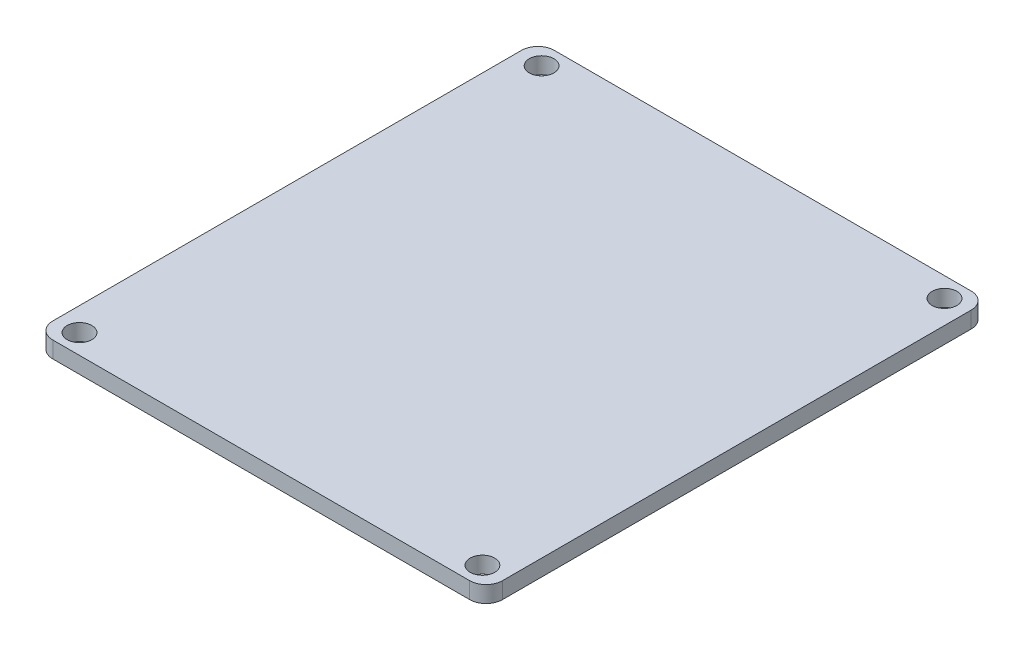
ISO-10303-21;
HEADER;
FILE_DESCRIPTION(('STEP AP214'),'2;1');
FILE_NAME('part.step','',(''),(''),'','','');
FILE_SCHEMA(('AUTOMOTIVE_DESIGN { 1 0 10303 214 1 1 1 1 }'));
ENDSEC;
DATA;
#1=APPLICATION_CONTEXT('core data for automotive mechanical design processes');
#2=APPLICATION_PROTOCOL_DEFINITION('international standard','automotive_design',2000,#1);
#3=PRODUCT_CONTEXT('',#1,'mechanical');
#4=PRODUCT('Part','Part','',(#3));
#5=PRODUCT_RELATED_PRODUCT_CATEGORY('part','',(#4));
#6=PRODUCT_DEFINITION_FORMATION('','',#4);
#7=PRODUCT_DEFINITION_CONTEXT('part definition',#1,'design');
#8=PRODUCT_DEFINITION('design','',#6,#7);
#9=PRODUCT_DEFINITION_SHAPE('','',#8);
#10=(LENGTH_UNIT() NAMED_UNIT(*) SI_UNIT(.MILLI.,.METRE.));
#11=(NAMED_UNIT(*) PLANE_ANGLE_UNIT() SI_UNIT($,.RADIAN.));
#12=(NAMED_UNIT(*) SI_UNIT($,.STERADIAN.) SOLID_ANGLE_UNIT());
#13=UNCERTAINTY_MEASURE_WITH_UNIT(LENGTH_MEASURE(1.E-05),#10,'distance_accuracy_value','');
#14=(GEOMETRIC_REPRESENTATION_CONTEXT(3) GLOBAL_UNCERTAINTY_ASSIGNED_CONTEXT((#13)) GLOBAL_UNIT_ASSIGNED_CONTEXT((#10,
#11,#12)) REPRESENTATION_CONTEXT('',''));
#15=CARTESIAN_POINT('',(0.,0.,0.));
#16=DIRECTION('',(0.,0.,1.));
#17=DIRECTION('',(1.,0.,0.));
#18=AXIS2_PLACEMENT_3D('',#15,#16,#17);
#19=CARTESIAN_POINT('',(0.,2.,0.));
#20=DIRECTION('',(0.,1.,0.));
#21=DIRECTION('',(0.,0.,1.));
#22=AXIS2_PLACEMENT_3D('',#19,#20,#21);
#23=PLANE('',#22);
#24=CARTESIAN_POINT('',(24.5,2.,-28.1));
#25=DIRECTION('',(0.,1.,0.));
#26=DIRECTION('',(0.,0.,-1.));
#27=AXIS2_PLACEMENT_3D('',#24,#25,#26);
#28=CIRCLE('',#27,1.5);
#29=CARTESIAN_POINT('',(24.5,2.,-29.6));
#30=VERTEX_POINT('',#29);
#31=EDGE_CURVE('E183',#30,#30,#28,.T.);
#32=ORIENTED_EDGE('',*,*,#31,.F.);
#33=EDGE_LOOP('',(#32));
#34=FACE_BOUND('',#33,.T.);
#35=CARTESIAN_POINT('',(-24.5,2.,-28.1));
#36=DIRECTION('',(0.,1.,0.));
#37=DIRECTION('',(0.,0.,1.));
#38=AXIS2_PLACEMENT_3D('',#35,#36,#37);
#39=CIRCLE('',#38,1.5);
#40=CARTESIAN_POINT('',(-24.5,2.,-26.6));
#41=VERTEX_POINT('',#40);
#42=EDGE_CURVE('E166',#41,#41,#39,.T.);
#43=ORIENTED_EDGE('',*,*,#42,.F.);
#44=EDGE_LOOP('',(#43));
#45=FACE_BOUND('',#44,.T.);
#46=DIRECTION('',(0.,0.,1.));
#47=VECTOR('',#46,1.);
#48=CARTESIAN_POINT('',(-27.35,2.,-30.5));
#49=LINE('',#48,#47);
#50=CARTESIAN_POINT('',(-27.35,2.,-28.5));
#51=VERTEX_POINT('',#50);
#52=CARTESIAN_POINT('',(-27.35,2.,28.5));
#53=VERTEX_POINT('',#52);
#54=EDGE_CURVE('E173',#51,#53,#49,.T.);
#55=ORIENTED_EDGE('',*,*,#54,.T.);
#56=CARTESIAN_POINT('',(-25.35,2.,28.5));
#57=DIRECTION('',(0.,1.,0.));
#58=DIRECTION('',(0.,0.,1.));
#59=AXIS2_PLACEMENT_3D('',#56,#57,#58);
#60=CIRCLE('',#59,2.);
#61=CARTESIAN_POINT('',(-25.35,2.,30.5));
#62=VERTEX_POINT('',#61);
#63=EDGE_CURVE('E150',#53,#62,#60,.T.);
#64=ORIENTED_EDGE('',*,*,#63,.T.);
#65=DIRECTION('',(1.,0.,0.));
#66=VECTOR('',#65,1.);
#67=CARTESIAN_POINT('',(-27.35,2.,30.5));
#68=LINE('',#67,#66);
#69=CARTESIAN_POINT('',(25.35,2.,30.5));
#70=VERTEX_POINT('',#69);
#71=EDGE_CURVE('E121',#62,#70,#68,.T.);
#72=ORIENTED_EDGE('',*,*,#71,.T.);
#73=CARTESIAN_POINT('',(25.35,2.,28.5));
#74=DIRECTION('',(0.,1.,0.));
#75=DIRECTION('',(0.,0.,1.));
#76=AXIS2_PLACEMENT_3D('',#73,#74,#75);
#77=CIRCLE('',#76,2.);
#78=CARTESIAN_POINT('',(27.35,2.,28.5));
#79=VERTEX_POINT('',#78);
#80=EDGE_CURVE('E145',#70,#79,#77,.T.);
#81=ORIENTED_EDGE('',*,*,#80,.T.);
#82=DIRECTION('',(0.,0.,-1.));
#83=VECTOR('',#82,1.);
#84=CARTESIAN_POINT('',(27.35,2.,-30.5));
#85=LINE('',#84,#83);
#86=CARTESIAN_POINT('',(27.35,2.,-28.5));
#87=VERTEX_POINT('',#86);
#88=EDGE_CURVE('E128',#79,#87,#85,.T.);
#89=ORIENTED_EDGE('',*,*,#88,.T.);
#90=CARTESIAN_POINT('',(25.35,2.,-28.5));
#91=DIRECTION('',(0.,1.,0.));
#92=DIRECTION('',(0.,0.,1.));
#93=AXIS2_PLACEMENT_3D('',#90,#91,#92);
#94=CIRCLE('',#93,2.);
#95=CARTESIAN_POINT('',(25.35,2.,-30.5));
#96=VERTEX_POINT('',#95);
#97=EDGE_CURVE('E57',#87,#96,#94,.T.);
#98=ORIENTED_EDGE('',*,*,#97,.T.);
#99=DIRECTION('',(-1.,0.,0.));
#100=VECTOR('',#99,1.);
#101=CARTESIAN_POINT('',(-27.35,2.,-30.5));
#102=LINE('',#101,#100);
#103=CARTESIAN_POINT('',(-25.35,2.,-30.5));
#104=VERTEX_POINT('',#103);
#105=EDGE_CURVE('E131',#96,#104,#102,.T.);
#106=ORIENTED_EDGE('',*,*,#105,.T.);
#107=CARTESIAN_POINT('',(-25.35,2.,-28.5));
#108=DIRECTION('',(0.,1.,0.));
#109=DIRECTION('',(0.,0.,1.));
#110=AXIS2_PLACEMENT_3D('',#107,#108,#109);
#111=CIRCLE('',#110,2.);
#112=EDGE_CURVE('E148',#104,#51,#111,.T.);
#113=ORIENTED_EDGE('',*,*,#112,.T.);
#114=EDGE_LOOP('',(#55,#64,#72,#81,#89,#98,#106,#113));
#115=FACE_BOUND('',#114,.T.);
#116=CARTESIAN_POINT('',(-24.5,2.,28.1));
#117=DIRECTION('',(0.,1.,0.));
#118=DIRECTION('',(0.,0.,-1.));
#119=AXIS2_PLACEMENT_3D('',#116,#117,#118);
#120=CIRCLE('',#119,1.5);
#121=CARTESIAN_POINT('',(-24.5,2.,26.6));
#122=VERTEX_POINT('',#121);
#123=EDGE_CURVE('E178',#122,#122,#120,.T.);
#124=ORIENTED_EDGE('',*,*,#123,.F.);
#125=EDGE_LOOP('',(#124));
#126=FACE_BOUND('',#125,.T.);
#127=CARTESIAN_POINT('',(24.5,2.,28.1));
#128=DIRECTION('',(0.,1.,0.));
#129=DIRECTION('',(0.,0.,1.));
#130=AXIS2_PLACEMENT_3D('',#127,#128,#129);
#131=CIRCLE('',#130,1.5);
#132=CARTESIAN_POINT('',(24.5,2.,29.6));
#133=VERTEX_POINT('',#132);
#134=EDGE_CURVE('E189',#133,#133,#131,.T.);
#135=ORIENTED_EDGE('',*,*,#134,.F.);
#136=EDGE_LOOP('',(#135));
#137=FACE_BOUND('',#136,.T.);
#138=ADVANCED_FACE('F35',(#34,#45,#115,#126,#137),#23,.T.);
#139=CARTESIAN_POINT('',(0.,0.,0.));
#140=DIRECTION('',(0.,1.,0.));
#141=DIRECTION('',(0.,0.,1.));
#142=AXIS2_PLACEMENT_3D('',#139,#140,#141);
#143=PLANE('',#142);
#144=DIRECTION('',(1.,0.,0.));
#145=VECTOR('',#144,1.);
#146=CARTESIAN_POINT('',(-27.35,0.,30.5));
#147=LINE('',#146,#145);
#148=CARTESIAN_POINT('',(-25.35,0.,30.5));
#149=VERTEX_POINT('',#148);
#150=CARTESIAN_POINT('',(25.35,0.,30.5));
#151=VERTEX_POINT('',#150);
#152=EDGE_CURVE('E118',#149,#151,#147,.T.);
#153=ORIENTED_EDGE('',*,*,#152,.F.);
#154=CARTESIAN_POINT('',(-25.35,0.,28.5));
#155=DIRECTION('',(0.,1.,0.));
#156=DIRECTION('',(0.,0.,1.));
#157=AXIS2_PLACEMENT_3D('',#154,#155,#156);
#158=CIRCLE('',#157,2.);
#159=CARTESIAN_POINT('',(-27.35,0.,28.5));
#160=VERTEX_POINT('',#159);
#161=EDGE_CURVE('E101',#149,#160,#158,.F.);
#162=ORIENTED_EDGE('',*,*,#161,.T.);
#163=DIRECTION('',(0.,0.,1.));
#164=VECTOR('',#163,1.);
#165=CARTESIAN_POINT('',(-27.35,0.,-30.5));
#166=LINE('',#165,#164);
#167=CARTESIAN_POINT('',(-27.35,0.,-28.5));
#168=VERTEX_POINT('',#167);
#169=EDGE_CURVE('E129',#168,#160,#166,.T.);
#170=ORIENTED_EDGE('',*,*,#169,.F.);
#171=CARTESIAN_POINT('',(-25.35,0.,-28.5));
#172=DIRECTION('',(0.,1.,0.));
#173=DIRECTION('',(0.,0.,1.));
#174=AXIS2_PLACEMENT_3D('',#171,#172,#173);
#175=CIRCLE('',#174,2.);
#176=CARTESIAN_POINT('',(-25.35,0.,-30.5));
#177=VERTEX_POINT('',#176);
#178=EDGE_CURVE('E112',#168,#177,#175,.F.);
#179=ORIENTED_EDGE('',*,*,#178,.T.);
#180=DIRECTION('',(-1.,0.,0.));
#181=VECTOR('',#180,1.);
#182=CARTESIAN_POINT('',(-27.35,0.,-30.5));
#183=LINE('',#182,#181);
#184=CARTESIAN_POINT('',(25.35,0.,-30.5));
#185=VERTEX_POINT('',#184);
#186=EDGE_CURVE('E133',#185,#177,#183,.T.);
#187=ORIENTED_EDGE('',*,*,#186,.F.);
#188=CARTESIAN_POINT('',(25.35,0.,-28.5));
#189=DIRECTION('',(0.,1.,0.));
#190=DIRECTION('',(0.,0.,1.));
#191=AXIS2_PLACEMENT_3D('',#188,#189,#190);
#192=CIRCLE('',#191,2.);
#193=CARTESIAN_POINT('',(27.35,0.,-28.5));
#194=VERTEX_POINT('',#193);
#195=EDGE_CURVE('E139',#185,#194,#192,.F.);
#196=ORIENTED_EDGE('',*,*,#195,.T.);
#197=DIRECTION('',(0.,0.,-1.));
#198=VECTOR('',#197,1.);
#199=CARTESIAN_POINT('',(27.35,0.,-30.5));
#200=LINE('',#199,#198);
#201=CARTESIAN_POINT('',(27.35,0.,28.5));
#202=VERTEX_POINT('',#201);
#203=EDGE_CURVE('E161',#202,#194,#200,.T.);
#204=ORIENTED_EDGE('',*,*,#203,.F.);
#205=CARTESIAN_POINT('',(25.35,0.,28.5));
#206=DIRECTION('',(0.,1.,0.));
#207=DIRECTION('',(0.,0.,1.));
#208=AXIS2_PLACEMENT_3D('',#205,#206,#207);
#209=CIRCLE('',#208,2.);
#210=EDGE_CURVE('E122',#202,#151,#209,.F.);
#211=ORIENTED_EDGE('',*,*,#210,.T.);
#212=EDGE_LOOP('',(#153,#162,#170,#179,#187,#196,#204,#211));
#213=FACE_BOUND('',#212,.T.);
#214=CARTESIAN_POINT('',(-24.5,0.,-28.1));
#215=DIRECTION('',(0.,1.,0.));
#216=DIRECTION('',(0.,0.,1.));
#217=AXIS2_PLACEMENT_3D('',#214,#215,#216);
#218=CIRCLE('',#217,1.5);
#219=CARTESIAN_POINT('',(-24.5,0.,-26.6));
#220=VERTEX_POINT('',#219);
#221=EDGE_CURVE('E169',#220,#220,#218,.T.);
#222=ORIENTED_EDGE('',*,*,#221,.T.);
#223=EDGE_LOOP('',(#222));
#224=FACE_BOUND('',#223,.T.);
#225=CARTESIAN_POINT('',(-24.5,0.,28.1));
#226=DIRECTION('',(0.,1.,0.));
#227=DIRECTION('',(0.,0.,-1.));
#228=AXIS2_PLACEMENT_3D('',#225,#226,#227);
#229=CIRCLE('',#228,1.5);
#230=CARTESIAN_POINT('',(-24.5,0.,26.6));
#231=VERTEX_POINT('',#230);
#232=EDGE_CURVE('E180',#231,#231,#229,.T.);
#233=ORIENTED_EDGE('',*,*,#232,.T.);
#234=EDGE_LOOP('',(#233));
#235=FACE_BOUND('',#234,.T.);
#236=CARTESIAN_POINT('',(24.5,0.,-28.1));
#237=DIRECTION('',(0.,1.,0.));
#238=DIRECTION('',(0.,0.,-1.));
#239=AXIS2_PLACEMENT_3D('',#236,#237,#238);
#240=CIRCLE('',#239,1.5);
#241=CARTESIAN_POINT('',(24.5,0.,-29.6));
#242=VERTEX_POINT('',#241);
#243=EDGE_CURVE('E186',#242,#242,#240,.T.);
#244=ORIENTED_EDGE('',*,*,#243,.T.);
#245=EDGE_LOOP('',(#244));
#246=FACE_BOUND('',#245,.T.);
#247=CARTESIAN_POINT('',(24.5,0.,28.1));
#248=DIRECTION('',(0.,1.,0.));
#249=DIRECTION('',(0.,0.,1.));
#250=AXIS2_PLACEMENT_3D('',#247,#248,#249);
#251=CIRCLE('',#250,1.5);
#252=CARTESIAN_POINT('',(24.5,0.,29.6));
#253=VERTEX_POINT('',#252);
#254=EDGE_CURVE('E192',#253,#253,#251,.T.);
#255=ORIENTED_EDGE('',*,*,#254,.T.);
#256=EDGE_LOOP('',(#255));
#257=FACE_BOUND('',#256,.T.);
#258=ADVANCED_FACE('F125',(#213,#224,#235,#246,#257),#143,.F.);
#259=CARTESIAN_POINT('',(27.35,2.,-30.5));
#260=DIRECTION('',(-1.,0.,0.));
#261=DIRECTION('',(0.,0.,1.));
#262=AXIS2_PLACEMENT_3D('',#259,#260,#261);
#263=PLANE('',#262);
#264=ORIENTED_EDGE('',*,*,#203,.T.);
#265=DIRECTION('',(0.,-1.,0.));
#266=VECTOR('',#265,1.);
#267=CARTESIAN_POINT('',(27.35,2.,-28.5));
#268=LINE('',#267,#266);
#269=EDGE_CURVE('E11',#194,#87,#268,.F.);
#270=ORIENTED_EDGE('',*,*,#269,.T.);
#271=ORIENTED_EDGE('',*,*,#88,.F.);
#272=DIRECTION('',(0.,-1.,0.));
#273=VECTOR('',#272,1.);
#274=CARTESIAN_POINT('',(27.35,2.,28.5));
#275=LINE('',#274,#273);
#276=EDGE_CURVE('E43',#79,#202,#275,.T.);
#277=ORIENTED_EDGE('',*,*,#276,.T.);
#278=EDGE_LOOP('',(#264,#270,#271,#277));
#279=FACE_BOUND('',#278,.T.);
#280=ADVANCED_FACE('F160',(#279),#263,.F.);
#281=CARTESIAN_POINT('',(-27.35,2.,-30.5));
#282=DIRECTION('',(0.,0.,1.));
#283=DIRECTION('',(1.,0.,0.));
#284=AXIS2_PLACEMENT_3D('',#281,#282,#283);
#285=PLANE('',#284);
#286=ORIENTED_EDGE('',*,*,#186,.T.);
#287=DIRECTION('',(0.,-1.,0.));
#288=VECTOR('',#287,1.);
#289=CARTESIAN_POINT('',(-25.35,2.,-30.5));
#290=LINE('',#289,#288);
#291=EDGE_CURVE('E50',#177,#104,#290,.F.);
#292=ORIENTED_EDGE('',*,*,#291,.T.);
#293=ORIENTED_EDGE('',*,*,#105,.F.);
#294=DIRECTION('',(0.,-1.,0.));
#295=VECTOR('',#294,1.);
#296=CARTESIAN_POINT('',(25.35,2.,-30.5));
#297=LINE('',#296,#295);
#298=EDGE_CURVE('E152',#96,#185,#297,.T.);
#299=ORIENTED_EDGE('',*,*,#298,.T.);
#300=EDGE_LOOP('',(#286,#292,#293,#299));
#301=FACE_BOUND('',#300,.T.);
#302=ADVANCED_FACE('F219',(#301),#285,.F.);
#303=CARTESIAN_POINT('',(-27.35,2.,-30.5));
#304=DIRECTION('',(1.,0.,0.));
#305=DIRECTION('',(0.,0.,-1.));
#306=AXIS2_PLACEMENT_3D('',#303,#304,#305);
#307=PLANE('',#306);
#308=ORIENTED_EDGE('',*,*,#169,.T.);
#309=DIRECTION('',(0.,-1.,0.));
#310=VECTOR('',#309,1.);
#311=CARTESIAN_POINT('',(-27.35,2.,28.5));
#312=LINE('',#311,#310);
#313=EDGE_CURVE('E106',#160,#53,#312,.F.);
#314=ORIENTED_EDGE('',*,*,#313,.T.);
#315=ORIENTED_EDGE('',*,*,#54,.F.);
#316=DIRECTION('',(0.,-1.,0.));
#317=VECTOR('',#316,1.);
#318=CARTESIAN_POINT('',(-27.35,2.,-28.5));
#319=LINE('',#318,#317);
#320=EDGE_CURVE('E111',#51,#168,#319,.T.);
#321=ORIENTED_EDGE('',*,*,#320,.T.);
#322=EDGE_LOOP('',(#308,#314,#315,#321));
#323=FACE_BOUND('',#322,.T.);
#324=ADVANCED_FACE('F216',(#323),#307,.F.);
#325=CARTESIAN_POINT('',(-27.35,2.,30.5));
#326=DIRECTION('',(0.,0.,-1.));
#327=DIRECTION('',(-1.,0.,0.));
#328=AXIS2_PLACEMENT_3D('',#325,#326,#327);
#329=PLANE('',#328);
#330=ORIENTED_EDGE('',*,*,#71,.F.);
#331=DIRECTION('',(0.,-1.,0.));
#332=VECTOR('',#331,1.);
#333=CARTESIAN_POINT('',(-25.35,2.,30.5));
#334=LINE('',#333,#332);
#335=EDGE_CURVE('E105',#62,#149,#334,.T.);
#336=ORIENTED_EDGE('',*,*,#335,.T.);
#337=ORIENTED_EDGE('',*,*,#152,.T.);
#338=DIRECTION('',(0.,-1.,0.));
#339=VECTOR('',#338,1.);
#340=CARTESIAN_POINT('',(25.35,2.,30.5));
#341=LINE('',#340,#339);
#342=EDGE_CURVE('E123',#151,#70,#341,.F.);
#343=ORIENTED_EDGE('',*,*,#342,.T.);
#344=EDGE_LOOP('',(#330,#336,#337,#343));
#345=FACE_BOUND('',#344,.T.);
#346=ADVANCED_FACE('F117',(#345),#329,.F.);
#347=CARTESIAN_POINT('',(-24.5,2.,-28.1));
#348=DIRECTION('',(0.,-1.,0.));
#349=DIRECTION('',(0.,0.,-1.));
#350=AXIS2_PLACEMENT_3D('',#347,#348,#349);
#351=CYLINDRICAL_SURFACE('',#350,1.5);
#352=ORIENTED_EDGE('',*,*,#42,.T.);
#353=EDGE_LOOP('',(#352));
#354=FACE_BOUND('',#353,.T.);
#355=ORIENTED_EDGE('',*,*,#221,.F.);
#356=EDGE_LOOP('',(#355));
#357=FACE_BOUND('',#356,.T.);
#358=ADVANCED_FACE('F211',(#354,#357),#351,.F.);
#359=CARTESIAN_POINT('',(-24.5,2.,28.1));
#360=DIRECTION('',(0.,-1.,0.));
#361=DIRECTION('',(0.,0.,-1.));
#362=AXIS2_PLACEMENT_3D('',#359,#360,#361);
#363=CYLINDRICAL_SURFACE('',#362,1.5);
#364=ORIENTED_EDGE('',*,*,#123,.T.);
#365=EDGE_LOOP('',(#364));
#366=FACE_BOUND('',#365,.T.);
#367=ORIENTED_EDGE('',*,*,#232,.F.);
#368=EDGE_LOOP('',(#367));
#369=FACE_BOUND('',#368,.T.);
#370=ADVANCED_FACE('F243',(#366,#369),#363,.F.);
#371=CARTESIAN_POINT('',(24.5,2.,-28.1));
#372=DIRECTION('',(0.,-1.,0.));
#373=DIRECTION('',(0.,0.,-1.));
#374=AXIS2_PLACEMENT_3D('',#371,#372,#373);
#375=CYLINDRICAL_SURFACE('',#374,1.5);
#376=ORIENTED_EDGE('',*,*,#31,.T.);
#377=EDGE_LOOP('',(#376));
#378=FACE_BOUND('',#377,.T.);
#379=ORIENTED_EDGE('',*,*,#243,.F.);
#380=EDGE_LOOP('',(#379));
#381=FACE_BOUND('',#380,.T.);
#382=ADVANCED_FACE('F246',(#378,#381),#375,.F.);
#383=CARTESIAN_POINT('',(24.5,2.,28.1));
#384=DIRECTION('',(0.,-1.,0.));
#385=DIRECTION('',(0.,0.,-1.));
#386=AXIS2_PLACEMENT_3D('',#383,#384,#385);
#387=CYLINDRICAL_SURFACE('',#386,1.5);
#388=ORIENTED_EDGE('',*,*,#134,.T.);
#389=EDGE_LOOP('',(#388));
#390=FACE_BOUND('',#389,.T.);
#391=ORIENTED_EDGE('',*,*,#254,.F.);
#392=EDGE_LOOP('',(#391));
#393=FACE_BOUND('',#392,.T.);
#394=ADVANCED_FACE('F198',(#390,#393),#387,.F.);
#395=CARTESIAN_POINT('',(-25.35,2.,28.5));
#396=DIRECTION('',(0.,-1.,0.));
#397=DIRECTION('',(0.,0.,-1.));
#398=AXIS2_PLACEMENT_3D('',#395,#396,#397);
#399=CYLINDRICAL_SURFACE('',#398,2.);
#400=ORIENTED_EDGE('',*,*,#63,.F.);
#401=ORIENTED_EDGE('',*,*,#313,.F.);
#402=ORIENTED_EDGE('',*,*,#161,.F.);
#403=ORIENTED_EDGE('',*,*,#335,.F.);
#404=EDGE_LOOP('',(#400,#401,#402,#403));
#405=FACE_BOUND('',#404,.T.);
#406=ADVANCED_FACE('F104',(#405),#399,.T.);
#407=CARTESIAN_POINT('',(-25.35,2.,-28.5));
#408=DIRECTION('',(0.,-1.,0.));
#409=DIRECTION('',(0.,0.,-1.));
#410=AXIS2_PLACEMENT_3D('',#407,#408,#409);
#411=CYLINDRICAL_SURFACE('',#410,2.);
#412=ORIENTED_EDGE('',*,*,#112,.F.);
#413=ORIENTED_EDGE('',*,*,#291,.F.);
#414=ORIENTED_EDGE('',*,*,#178,.F.);
#415=ORIENTED_EDGE('',*,*,#320,.F.);
#416=EDGE_LOOP('',(#412,#413,#414,#415));
#417=FACE_BOUND('',#416,.T.);
#418=ADVANCED_FACE('F227',(#417),#411,.T.);
#419=CARTESIAN_POINT('',(25.35,2.,-28.5));
#420=DIRECTION('',(0.,-1.,0.));
#421=DIRECTION('',(0.,0.,-1.));
#422=AXIS2_PLACEMENT_3D('',#419,#420,#421);
#423=CYLINDRICAL_SURFACE('',#422,2.);
#424=ORIENTED_EDGE('',*,*,#97,.F.);
#425=ORIENTED_EDGE('',*,*,#269,.F.);
#426=ORIENTED_EDGE('',*,*,#195,.F.);
#427=ORIENTED_EDGE('',*,*,#298,.F.);
#428=EDGE_LOOP('',(#424,#425,#426,#427));
#429=FACE_BOUND('',#428,.T.);
#430=ADVANCED_FACE('F229',(#429),#423,.T.);
#431=CARTESIAN_POINT('',(25.35,2.,28.5));
#432=DIRECTION('',(0.,-1.,0.));
#433=DIRECTION('',(0.,0.,-1.));
#434=AXIS2_PLACEMENT_3D('',#431,#432,#433);
#435=CYLINDRICAL_SURFACE('',#434,2.);
#436=ORIENTED_EDGE('',*,*,#80,.F.);
#437=ORIENTED_EDGE('',*,*,#342,.F.);
#438=ORIENTED_EDGE('',*,*,#210,.F.);
#439=ORIENTED_EDGE('',*,*,#276,.F.);
#440=EDGE_LOOP('',(#436,#437,#438,#439));
#441=FACE_BOUND('',#440,.T.);
#442=ADVANCED_FACE('F37',(#441),#435,.T.);
#443=CLOSED_SHELL('',(#138,#258,#280,#302,#324,#346,#358,#370,#382,#394,#406,#418,#430,#442));
#444=MANIFOLD_SOLID_BREP('B2',#443);
#445=ADVANCED_BREP_SHAPE_REPRESENTATION('',(#18,#444),#14);
#446=SHAPE_DEFINITION_REPRESENTATION(#9,#445);
ENDSEC;
END-ISO-10303-21;
